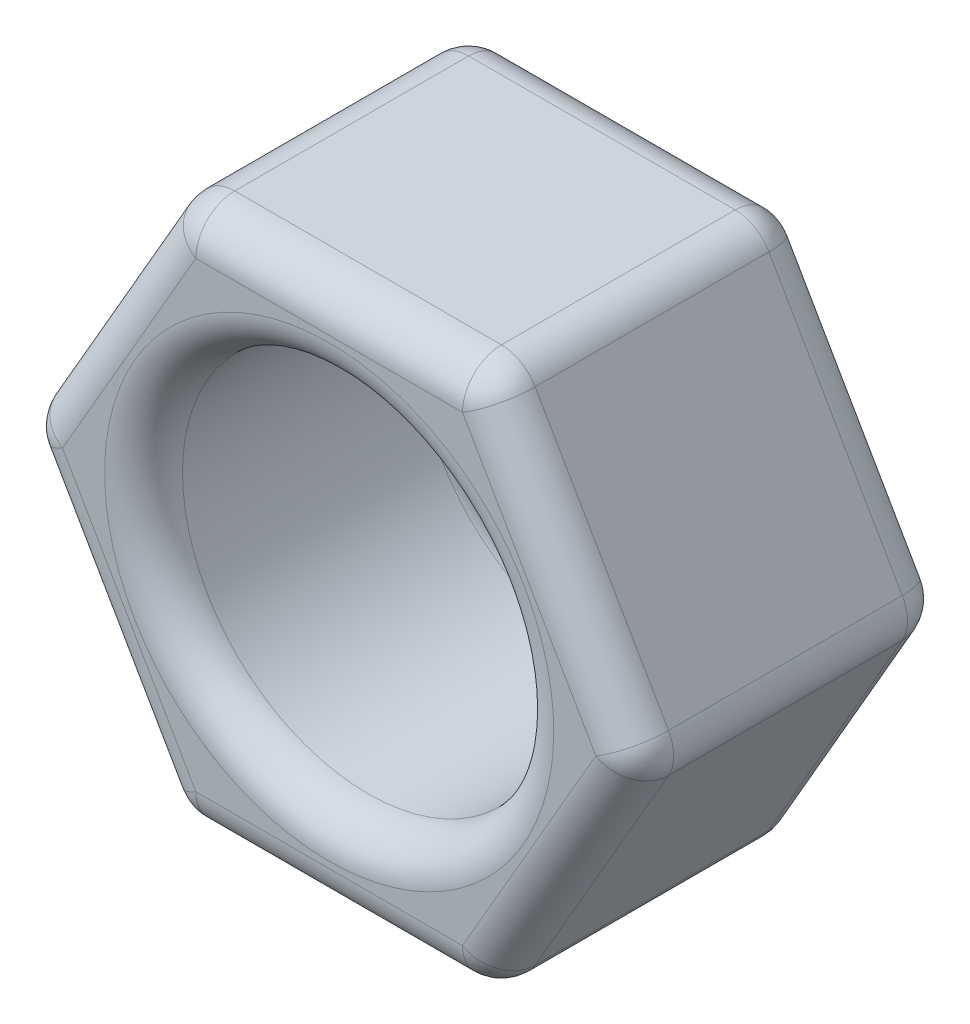
ISO-10303-21;
HEADER;
FILE_DESCRIPTION(('STEP AP214'),'2;1');
FILE_NAME('part.step','',(''),(''),'','','');
FILE_SCHEMA(('AUTOMOTIVE_DESIGN { 1 0 10303 214 1 1 1 1 }'));
ENDSEC;
DATA;
#1=APPLICATION_CONTEXT('core data for automotive mechanical design processes');
#2=APPLICATION_PROTOCOL_DEFINITION('international standard','automotive_design',2000,#1);
#3=PRODUCT_CONTEXT('',#1,'mechanical');
#4=PRODUCT('Part','Part','',(#3));
#5=PRODUCT_RELATED_PRODUCT_CATEGORY('part','',(#4));
#6=PRODUCT_DEFINITION_FORMATION('','',#4);
#7=PRODUCT_DEFINITION_CONTEXT('part definition',#1,'design');
#8=PRODUCT_DEFINITION('design','',#6,#7);
#9=PRODUCT_DEFINITION_SHAPE('','',#8);
#10=(LENGTH_UNIT() NAMED_UNIT(*) SI_UNIT(.MILLI.,.METRE.));
#11=(NAMED_UNIT(*) PLANE_ANGLE_UNIT() SI_UNIT($,.RADIAN.));
#12=(NAMED_UNIT(*) SI_UNIT($,.STERADIAN.) SOLID_ANGLE_UNIT());
#13=UNCERTAINTY_MEASURE_WITH_UNIT(LENGTH_MEASURE(1.E-05),#10,'distance_accuracy_value','');
#14=(GEOMETRIC_REPRESENTATION_CONTEXT(3) GLOBAL_UNCERTAINTY_ASSIGNED_CONTEXT((#13)) GLOBAL_UNIT_ASSIGNED_CONTEXT((#10,
#11,#12)) REPRESENTATION_CONTEXT('',''));
#15=CARTESIAN_POINT('',(0.,0.,0.));
#16=DIRECTION('',(0.,0.,1.));
#17=DIRECTION('',(1.,0.,0.));
#18=AXIS2_PLACEMENT_3D('',#15,#16,#17);
#19=CARTESIAN_POINT('',(7.99999999999999,0.,8.));
#20=DIRECTION('',(0.,0.,1.));
#21=DIRECTION('',(1.,0.,0.));
#22=AXIS2_PLACEMENT_3D('',#19,#20,#21);
#23=PLANE('',#22);
#24=DIRECTION('',(0.5,-0.866025403784439,0.));
#25=VECTOR('',#24,1.);
#26=CARTESIAN_POINT('',(-3.13397459621556,-6.42820323027552,8.));
#27=LINE('',#26,#25);
#28=CARTESIAN_POINT('',(-6.84529946162075,0.,8.));
#29=VERTEX_POINT('',#28);
#30=CARTESIAN_POINT('',(-3.42264973081038,-5.92820323027552,8.));
#31=VERTEX_POINT('',#30);
#32=EDGE_CURVE('E253',#29,#31,#27,.T.);
#33=ORIENTED_EDGE('',*,*,#32,.T.);
#34=DIRECTION('',(1.,0.,0.));
#35=VECTOR('',#34,1.);
#36=CARTESIAN_POINT('',(4.,-5.92820323027552,8.));
#37=LINE('',#36,#35);
#38=CARTESIAN_POINT('',(3.42264973081037,-5.92820323027552,8.));
#39=VERTEX_POINT('',#38);
#40=EDGE_CURVE('E255',#31,#39,#37,.T.);
#41=ORIENTED_EDGE('',*,*,#40,.T.);
#42=DIRECTION('',(0.499999999999999,0.866025403784439,0.));
#43=VECTOR('',#42,1.);
#44=CARTESIAN_POINT('',(7.13397459621555,0.499999999999997,8.));
#45=LINE('',#44,#43);
#46=CARTESIAN_POINT('',(6.84529946162074,0.,8.));
#47=VERTEX_POINT('',#46);
#48=EDGE_CURVE('E245',#39,#47,#45,.T.);
#49=ORIENTED_EDGE('',*,*,#48,.T.);
#50=DIRECTION('',(-0.5,0.866025403784439,0.));
#51=VECTOR('',#50,1.);
#52=CARTESIAN_POINT('',(3.13397459621555,6.42820323027551,8.));
#53=LINE('',#52,#51);
#54=CARTESIAN_POINT('',(3.42264973081037,5.92820323027551,8.));
#55=VERTEX_POINT('',#54);
#56=EDGE_CURVE('E247',#47,#55,#53,.T.);
#57=ORIENTED_EDGE('',*,*,#56,.T.);
#58=DIRECTION('',(-1.,0.,0.));
#59=VECTOR('',#58,1.);
#60=CARTESIAN_POINT('',(-4.,5.92820323027551,8.));
#61=LINE('',#60,#59);
#62=CARTESIAN_POINT('',(-3.42264973081038,5.92820323027551,8.));
#63=VERTEX_POINT('',#62);
#64=EDGE_CURVE('E249',#55,#63,#61,.T.);
#65=ORIENTED_EDGE('',*,*,#64,.T.);
#66=DIRECTION('',(-0.5,-0.866025403784439,0.));
#67=VECTOR('',#66,1.);
#68=CARTESIAN_POINT('',(-7.13397459621556,-0.500000000000003,8.));
#69=LINE('',#68,#67);
#70=EDGE_CURVE('E251',#63,#29,#69,.T.);
#71=ORIENTED_EDGE('',*,*,#70,.T.);
#72=EDGE_LOOP('',(#33,#41,#49,#57,#65,#71));
#73=FACE_BOUND('',#72,.T.);
#74=CARTESIAN_POINT('',(0.,0.,8.));
#75=DIRECTION('',(0.,0.,1.));
#76=DIRECTION('',(1.,0.,0.));
#77=AXIS2_PLACEMENT_3D('',#74,#75,#76);
#78=CIRCLE('',#77,5.765);
#79=CARTESIAN_POINT('',(5.765,0.,8.));
#80=VERTEX_POINT('',#79);
#81=EDGE_CURVE('E242',#80,#80,#78,.F.);
#82=ORIENTED_EDGE('',*,*,#81,.T.);
#83=EDGE_LOOP('',(#82));
#84=FACE_BOUND('',#83,.T.);
#85=ADVANCED_FACE('F31',(#73,#84),#23,.T.);
#86=CARTESIAN_POINT('',(7.99999999999999,0.,0.));
#87=DIRECTION('',(0.,0.,1.));
#88=DIRECTION('',(1.,0.,0.));
#89=AXIS2_PLACEMENT_3D('',#86,#87,#88);
#90=PLANE('',#89);
#91=DIRECTION('',(0.499999999999999,0.866025403784439,0.));
#92=VECTOR('',#91,1.);
#93=CARTESIAN_POINT('',(7.13397459621555,0.499999999999996,0.));
#94=LINE('',#93,#92);
#95=CARTESIAN_POINT('',(6.84529946162074,0.,0.));
#96=VERTEX_POINT('',#95);
#97=CARTESIAN_POINT('',(3.42264973081037,-5.92820323027552,0.));
#98=VERTEX_POINT('',#97);
#99=EDGE_CURVE('E261',#96,#98,#94,.F.);
#100=ORIENTED_EDGE('',*,*,#99,.T.);
#101=DIRECTION('',(1.,0.,0.));
#102=VECTOR('',#101,1.);
#103=CARTESIAN_POINT('',(7.99999999999999,-5.92820323027552,0.));
#104=LINE('',#103,#102);
#105=CARTESIAN_POINT('',(-3.42264973081038,-5.92820323027552,0.));
#106=VERTEX_POINT('',#105);
#107=EDGE_CURVE('E270',#98,#106,#104,.F.);
#108=ORIENTED_EDGE('',*,*,#107,.T.);
#109=DIRECTION('',(0.5,-0.866025403784439,0.));
#110=VECTOR('',#109,1.);
#111=CARTESIAN_POINT('',(-3.13397459621557,-6.42820323027551,0.));
#112=LINE('',#111,#110);
#113=CARTESIAN_POINT('',(-6.84529946162075,0.,0.));
#114=VERTEX_POINT('',#113);
#115=EDGE_CURVE('E56',#106,#114,#112,.F.);
#116=ORIENTED_EDGE('',*,*,#115,.T.);
#117=DIRECTION('',(-0.5,-0.866025403784439,0.));
#118=VECTOR('',#117,1.);
#119=CARTESIAN_POINT('',(-3.13397459621557,6.4282032302755,0.));
#120=LINE('',#119,#118);
#121=CARTESIAN_POINT('',(-3.42264973081038,5.92820323027551,0.));
#122=VERTEX_POINT('',#121);
#123=EDGE_CURVE('E267',#114,#122,#120,.F.);
#124=ORIENTED_EDGE('',*,*,#123,.T.);
#125=DIRECTION('',(-1.,0.,0.));
#126=VECTOR('',#125,1.);
#127=CARTESIAN_POINT('',(7.99999999999999,5.92820323027551,0.));
#128=LINE('',#127,#126);
#129=CARTESIAN_POINT('',(3.42264973081037,5.92820323027551,0.));
#130=VERTEX_POINT('',#129);
#131=EDGE_CURVE('E265',#122,#130,#128,.F.);
#132=ORIENTED_EDGE('',*,*,#131,.T.);
#133=DIRECTION('',(-0.5,0.866025403784439,0.));
#134=VECTOR('',#133,1.);
#135=CARTESIAN_POINT('',(7.13397459621556,-0.500000000000003,0.));
#136=LINE('',#135,#134);
#137=EDGE_CURVE('E263',#130,#96,#136,.F.);
#138=ORIENTED_EDGE('',*,*,#137,.T.);
#139=EDGE_LOOP('',(#100,#108,#116,#124,#132,#138));
#140=FACE_BOUND('',#139,.T.);
#141=CARTESIAN_POINT('',(0.,0.,0.));
#142=DIRECTION('',(0.,0.,1.));
#143=DIRECTION('',(1.,0.,0.));
#144=AXIS2_PLACEMENT_3D('',#141,#142,#143);
#145=CIRCLE('',#144,5.765);
#146=CARTESIAN_POINT('',(5.765,0.,0.));
#147=VERTEX_POINT('',#146);
#148=EDGE_CURVE('E258',#147,#147,#145,.T.);
#149=ORIENTED_EDGE('',*,*,#148,.T.);
#150=EDGE_LOOP('',(#149));
#151=FACE_BOUND('',#150,.T.);
#152=ADVANCED_FACE('F430',(#140,#151),#90,.F.);
#153=CARTESIAN_POINT('',(4.,-6.92820323027552,8.));
#154=DIRECTION('',(-0.866025403784439,0.499999999999999,0.));
#155=DIRECTION('',(-0.499999999999999,-0.866025403784439,0.));
#156=AXIS2_PLACEMENT_3D('',#153,#154,#155);
#157=PLANE('',#156);
#158=DIRECTION('',(0.,0.,-1.));
#159=VECTOR('',#158,1.);
#160=CARTESIAN_POINT('',(7.71132486540518,-0.500000000000002,8.));
#161=LINE('',#160,#159);
#162=CARTESIAN_POINT('',(7.71132486540518,-0.500000000000002,1.));
#163=VERTEX_POINT('',#162);
#164=CARTESIAN_POINT('',(7.71132486540518,-0.500000000000002,7.));
#165=VERTEX_POINT('',#164);
#166=EDGE_CURVE('E167',#163,#165,#161,.F.);
#167=ORIENTED_EDGE('',*,*,#166,.T.);
#168=DIRECTION('',(0.499999999999999,0.866025403784439,0.));
#169=VECTOR('',#168,1.);
#170=CARTESIAN_POINT('',(4.,-6.92820323027552,7.));
#171=LINE('',#170,#169);
#172=CARTESIAN_POINT('',(4.28867513459481,-6.42820323027552,7.));
#173=VERTEX_POINT('',#172);
#174=EDGE_CURVE('E204',#165,#173,#171,.F.);
#175=ORIENTED_EDGE('',*,*,#174,.T.);
#176=DIRECTION('',(0.,0.,-1.));
#177=VECTOR('',#176,1.);
#178=CARTESIAN_POINT('',(4.28867513459481,-6.42820323027552,8.));
#179=LINE('',#178,#177);
#180=CARTESIAN_POINT('',(4.28867513459481,-6.42820323027552,1.));
#181=VERTEX_POINT('',#180);
#182=EDGE_CURVE('E201',#173,#181,#179,.T.);
#183=ORIENTED_EDGE('',*,*,#182,.T.);
#184=DIRECTION('',(0.499999999999999,0.866025403784439,0.));
#185=VECTOR('',#184,1.);
#186=CARTESIAN_POINT('',(4.,-6.92820323027552,1.));
#187=LINE('',#186,#185);
#188=EDGE_CURVE('E196',#181,#163,#187,.T.);
#189=ORIENTED_EDGE('',*,*,#188,.T.);
#190=EDGE_LOOP('',(#167,#175,#183,#189));
#191=FACE_BOUND('',#190,.T.);
#192=ADVANCED_FACE('F435',(#191),#157,.F.);
#193=CARTESIAN_POINT('',(7.99999999999999,0.,8.));
#194=DIRECTION('',(-0.866025403784439,-0.5,0.));
#195=DIRECTION('',(0.5,-0.866025403784439,0.));
#196=AXIS2_PLACEMENT_3D('',#193,#194,#195);
#197=PLANE('',#196);
#198=DIRECTION('',(0.,0.,-1.));
#199=VECTOR('',#198,1.);
#200=CARTESIAN_POINT('',(4.28867513459481,6.42820323027551,8.));
#201=LINE('',#200,#199);
#202=CARTESIAN_POINT('',(4.28867513459481,6.42820323027551,1.));
#203=VERTEX_POINT('',#202);
#204=CARTESIAN_POINT('',(4.28867513459481,6.42820323027551,7.));
#205=VERTEX_POINT('',#204);
#206=EDGE_CURVE('E189',#203,#205,#201,.F.);
#207=ORIENTED_EDGE('',*,*,#206,.T.);
#208=DIRECTION('',(-0.5,0.866025403784439,0.));
#209=VECTOR('',#208,1.);
#210=CARTESIAN_POINT('',(7.99999999999999,0.,7.));
#211=LINE('',#210,#209);
#212=CARTESIAN_POINT('',(7.71132486540518,0.499999999999997,7.));
#213=VERTEX_POINT('',#212);
#214=EDGE_CURVE('E193',#205,#213,#211,.F.);
#215=ORIENTED_EDGE('',*,*,#214,.T.);
#216=DIRECTION('',(0.,0.,-1.));
#217=VECTOR('',#216,1.);
#218=CARTESIAN_POINT('',(7.71132486540518,0.499999999999997,8.));
#219=LINE('',#218,#217);
#220=CARTESIAN_POINT('',(7.71132486540518,0.499999999999997,1.));
#221=VERTEX_POINT('',#220);
#222=EDGE_CURVE('E165',#213,#221,#219,.T.);
#223=ORIENTED_EDGE('',*,*,#222,.T.);
#224=DIRECTION('',(-0.5,0.866025403784439,0.));
#225=VECTOR('',#224,1.);
#226=CARTESIAN_POINT('',(7.99999999999999,0.,1.));
#227=LINE('',#226,#225);
#228=EDGE_CURVE('E183',#221,#203,#227,.T.);
#229=ORIENTED_EDGE('',*,*,#228,.T.);
#230=EDGE_LOOP('',(#207,#215,#223,#229));
#231=FACE_BOUND('',#230,.T.);
#232=ADVANCED_FACE('F191',(#231),#197,.F.);
#233=CARTESIAN_POINT('',(3.99999999999999,6.92820323027551,8.));
#234=DIRECTION('',(0.,-1.,0.));
#235=DIRECTION('',(0.,0.,-1.));
#236=AXIS2_PLACEMENT_3D('',#233,#234,#235);
#237=PLANE('',#236);
#238=DIRECTION('',(0.,0.,-1.));
#239=VECTOR('',#238,1.);
#240=CARTESIAN_POINT('',(-3.42264973081038,6.92820323027551,8.));
#241=LINE('',#240,#239);
#242=CARTESIAN_POINT('',(-3.42264973081038,6.92820323027551,1.));
#243=VERTEX_POINT('',#242);
#244=CARTESIAN_POINT('',(-3.42264973081038,6.92820323027551,7.));
#245=VERTEX_POINT('',#244);
#246=EDGE_CURVE('E208',#243,#245,#241,.F.);
#247=ORIENTED_EDGE('',*,*,#246,.T.);
#248=DIRECTION('',(-1.,0.,0.));
#249=VECTOR('',#248,1.);
#250=CARTESIAN_POINT('',(3.99999999999999,6.92820323027551,7.));
#251=LINE('',#250,#249);
#252=CARTESIAN_POINT('',(3.42264973081037,6.92820323027551,7.));
#253=VERTEX_POINT('',#252);
#254=EDGE_CURVE('E213',#245,#253,#251,.F.);
#255=ORIENTED_EDGE('',*,*,#254,.T.);
#256=DIRECTION('',(0.,0.,-1.));
#257=VECTOR('',#256,1.);
#258=CARTESIAN_POINT('',(3.42264973081037,6.92820323027551,8.));
#259=LINE('',#258,#257);
#260=CARTESIAN_POINT('',(3.42264973081037,6.92820323027551,1.));
#261=VERTEX_POINT('',#260);
#262=EDGE_CURVE('E210',#253,#261,#259,.T.);
#263=ORIENTED_EDGE('',*,*,#262,.T.);
#264=DIRECTION('',(-1.,0.,0.));
#265=VECTOR('',#264,1.);
#266=CARTESIAN_POINT('',(3.99999999999999,6.92820323027551,1.));
#267=LINE('',#266,#265);
#268=EDGE_CURVE('E206',#261,#243,#267,.T.);
#269=ORIENTED_EDGE('',*,*,#268,.T.);
#270=EDGE_LOOP('',(#247,#255,#263,#269));
#271=FACE_BOUND('',#270,.T.);
#272=ADVANCED_FACE('F448',(#271),#237,.F.);
#273=CARTESIAN_POINT('',(-4.,6.92820323027551,8.));
#274=DIRECTION('',(0.866025403784439,-0.5,0.));
#275=DIRECTION('',(0.5,0.866025403784439,0.));
#276=AXIS2_PLACEMENT_3D('',#273,#274,#275);
#277=PLANE('',#276);
#278=DIRECTION('',(0.,0.,-1.));
#279=VECTOR('',#278,1.);
#280=CARTESIAN_POINT('',(-7.71132486540519,0.499999999999996,8.));
#281=LINE('',#280,#279);
#282=CARTESIAN_POINT('',(-7.71132486540519,0.499999999999996,1.));
#283=VERTEX_POINT('',#282);
#284=CARTESIAN_POINT('',(-7.71132486540519,0.499999999999996,7.));
#285=VERTEX_POINT('',#284);
#286=EDGE_CURVE('E217',#283,#285,#281,.F.);
#287=ORIENTED_EDGE('',*,*,#286,.T.);
#288=DIRECTION('',(-0.5,-0.866025403784439,0.));
#289=VECTOR('',#288,1.);
#290=CARTESIAN_POINT('',(-4.,6.92820323027551,7.));
#291=LINE('',#290,#289);
#292=CARTESIAN_POINT('',(-4.28867513459482,6.42820323027551,7.));
#293=VERTEX_POINT('',#292);
#294=EDGE_CURVE('E222',#285,#293,#291,.F.);
#295=ORIENTED_EDGE('',*,*,#294,.T.);
#296=DIRECTION('',(0.,0.,-1.));
#297=VECTOR('',#296,1.);
#298=CARTESIAN_POINT('',(-4.28867513459482,6.42820323027551,8.));
#299=LINE('',#298,#297);
#300=CARTESIAN_POINT('',(-4.28867513459482,6.42820323027551,1.));
#301=VERTEX_POINT('',#300);
#302=EDGE_CURVE('E219',#293,#301,#299,.T.);
#303=ORIENTED_EDGE('',*,*,#302,.T.);
#304=DIRECTION('',(-0.5,-0.866025403784439,0.));
#305=VECTOR('',#304,1.);
#306=CARTESIAN_POINT('',(-4.,6.92820323027551,1.));
#307=LINE('',#306,#305);
#308=EDGE_CURVE('E215',#301,#283,#307,.T.);
#309=ORIENTED_EDGE('',*,*,#308,.T.);
#310=EDGE_LOOP('',(#287,#295,#303,#309));
#311=FACE_BOUND('',#310,.T.);
#312=ADVANCED_FACE('F389',(#311),#277,.F.);
#313=CARTESIAN_POINT('',(-8.,0.,8.));
#314=DIRECTION('',(0.866025403784439,0.5,0.));
#315=DIRECTION('',(-0.5,0.866025403784439,0.));
#316=AXIS2_PLACEMENT_3D('',#313,#314,#315);
#317=PLANE('',#316);
#318=DIRECTION('',(0.,0.,-1.));
#319=VECTOR('',#318,1.);
#320=CARTESIAN_POINT('',(-4.28867513459482,-6.42820323027552,8.));
#321=LINE('',#320,#319);
#322=CARTESIAN_POINT('',(-4.28867513459482,-6.42820323027552,1.));
#323=VERTEX_POINT('',#322);
#324=CARTESIAN_POINT('',(-4.28867513459482,-6.42820323027552,7.));
#325=VERTEX_POINT('',#324);
#326=EDGE_CURVE('E226',#323,#325,#321,.F.);
#327=ORIENTED_EDGE('',*,*,#326,.T.);
#328=DIRECTION('',(0.5,-0.866025403784439,0.));
#329=VECTOR('',#328,1.);
#330=CARTESIAN_POINT('',(-8.,0.,7.));
#331=LINE('',#330,#329);
#332=CARTESIAN_POINT('',(-7.71132486540519,-0.500000000000004,7.));
#333=VERTEX_POINT('',#332);
#334=EDGE_CURVE('E231',#325,#333,#331,.F.);
#335=ORIENTED_EDGE('',*,*,#334,.T.);
#336=DIRECTION('',(0.,0.,-1.));
#337=VECTOR('',#336,1.);
#338=CARTESIAN_POINT('',(-7.71132486540519,-0.500000000000004,8.));
#339=LINE('',#338,#337);
#340=CARTESIAN_POINT('',(-7.71132486540519,-0.500000000000004,1.));
#341=VERTEX_POINT('',#340);
#342=EDGE_CURVE('E228',#333,#341,#339,.T.);
#343=ORIENTED_EDGE('',*,*,#342,.T.);
#344=DIRECTION('',(0.5,-0.866025403784439,0.));
#345=VECTOR('',#344,1.);
#346=CARTESIAN_POINT('',(-8.,0.,1.));
#347=LINE('',#346,#345);
#348=EDGE_CURVE('E224',#341,#323,#347,.T.);
#349=ORIENTED_EDGE('',*,*,#348,.T.);
#350=EDGE_LOOP('',(#327,#335,#343,#349));
#351=FACE_BOUND('',#350,.T.);
#352=ADVANCED_FACE('F405',(#351),#317,.F.);
#353=CARTESIAN_POINT('',(-4.,-6.92820323027552,8.));
#354=DIRECTION('',(0.,1.,0.));
#355=DIRECTION('',(0.,0.,1.));
#356=AXIS2_PLACEMENT_3D('',#353,#354,#355);
#357=PLANE('',#356);
#358=DIRECTION('',(0.,0.,-1.));
#359=VECTOR('',#358,1.);
#360=CARTESIAN_POINT('',(3.42264973081037,-6.92820323027552,8.));
#361=LINE('',#360,#359);
#362=CARTESIAN_POINT('',(3.42264973081037,-6.92820323027552,1.));
#363=VERTEX_POINT('',#362);
#364=CARTESIAN_POINT('',(3.42264973081037,-6.92820323027552,7.));
#365=VERTEX_POINT('',#364);
#366=EDGE_CURVE('E235',#363,#365,#361,.F.);
#367=ORIENTED_EDGE('',*,*,#366,.T.);
#368=DIRECTION('',(1.,0.,0.));
#369=VECTOR('',#368,1.);
#370=CARTESIAN_POINT('',(-4.,-6.92820323027552,7.));
#371=LINE('',#370,#369);
#372=CARTESIAN_POINT('',(-3.42264973081038,-6.92820323027552,7.));
#373=VERTEX_POINT('',#372);
#374=EDGE_CURVE('E240',#365,#373,#371,.F.);
#375=ORIENTED_EDGE('',*,*,#374,.T.);
#376=DIRECTION('',(0.,0.,-1.));
#377=VECTOR('',#376,1.);
#378=CARTESIAN_POINT('',(-3.42264973081038,-6.92820323027552,8.));
#379=LINE('',#378,#377);
#380=CARTESIAN_POINT('',(-3.42264973081038,-6.92820323027552,1.));
#381=VERTEX_POINT('',#380);
#382=EDGE_CURVE('E237',#373,#381,#379,.T.);
#383=ORIENTED_EDGE('',*,*,#382,.T.);
#384=DIRECTION('',(1.,0.,0.));
#385=VECTOR('',#384,1.);
#386=CARTESIAN_POINT('',(-4.,-6.92820323027552,1.));
#387=LINE('',#386,#385);
#388=EDGE_CURVE('E233',#381,#363,#387,.T.);
#389=ORIENTED_EDGE('',*,*,#388,.T.);
#390=EDGE_LOOP('',(#367,#375,#383,#389));
#391=FACE_BOUND('',#390,.T.);
#392=ADVANCED_FACE('F440',(#391),#357,.F.);
#393=CARTESIAN_POINT('',(0.,0.,8.));
#394=DIRECTION('',(0.,0.,-1.));
#395=DIRECTION('',(-1.,0.,0.));
#396=AXIS2_PLACEMENT_3D('',#393,#394,#395);
#397=CYLINDRICAL_SURFACE('',#396,4.765);
#398=CARTESIAN_POINT('',(0.,0.,7.));
#399=DIRECTION('',(0.,0.,1.));
#400=DIRECTION('',(1.,0.,0.));
#401=AXIS2_PLACEMENT_3D('',#398,#399,#400);
#402=CIRCLE('',#401,4.765);
#403=CARTESIAN_POINT('',(4.765,0.,7.));
#404=VERTEX_POINT('',#403);
#405=EDGE_CURVE('E11',#404,#404,#402,.T.);
#406=ORIENTED_EDGE('',*,*,#405,.T.);
#407=EDGE_LOOP('',(#406));
#408=FACE_BOUND('',#407,.T.);
#409=CARTESIAN_POINT('',(0.,0.,1.));
#410=DIRECTION('',(0.,0.,1.));
#411=DIRECTION('',(1.,0.,0.));
#412=AXIS2_PLACEMENT_3D('',#409,#410,#411);
#413=CIRCLE('',#412,4.765);
#414=CARTESIAN_POINT('',(4.765,0.,1.));
#415=VERTEX_POINT('',#414);
#416=EDGE_CURVE('E40',#415,#415,#413,.F.);
#417=ORIENTED_EDGE('',*,*,#416,.T.);
#418=EDGE_LOOP('',(#417));
#419=FACE_BOUND('',#418,.T.);
#420=ADVANCED_FACE('F438',(#408,#419),#397,.F.);
#421=CARTESIAN_POINT('',(-6.84529946162075,0.,8.));
#422=DIRECTION('',(0.,0.,-1.));
#423=DIRECTION('',(-1.,0.,0.));
#424=AXIS2_PLACEMENT_3D('',#421,#422,#423);
#425=CYLINDRICAL_SURFACE('',#424,1.);
#426=CARTESIAN_POINT('',(-6.84529946162075,0.,7.));
#427=DIRECTION('',(0.,0.,1.));
#428=DIRECTION('',(1.,0.,0.));
#429=AXIS2_PLACEMENT_3D('',#426,#427,#428);
#430=CIRCLE('',#429,1.);
#431=EDGE_CURVE('E35',#285,#333,#430,.T.);
#432=ORIENTED_EDGE('',*,*,#431,.F.);
#433=ORIENTED_EDGE('',*,*,#286,.F.);
#434=CARTESIAN_POINT('',(-6.84529946162075,0.,1.));
#435=DIRECTION('',(0.,0.,-1.));
#436=DIRECTION('',(-1.,0.,0.));
#437=AXIS2_PLACEMENT_3D('',#434,#435,#436);
#438=CIRCLE('',#437,1.);
#439=EDGE_CURVE('E356',#341,#283,#438,.T.);
#440=ORIENTED_EDGE('',*,*,#439,.F.);
#441=ORIENTED_EDGE('',*,*,#342,.F.);
#442=EDGE_LOOP('',(#432,#433,#440,#441));
#443=FACE_BOUND('',#442,.T.);
#444=ADVANCED_FACE('F403',(#443),#425,.T.);
#445=CARTESIAN_POINT('',(-6.84529946162075,0.,7.));
#446=DIRECTION('',(0.,0.,1.));
#447=DIRECTION('',(1.,0.,0.));
#448=AXIS2_PLACEMENT_3D('',#445,#446,#447);
#449=SPHERICAL_SURFACE('',#448,1.);
#450=CARTESIAN_POINT('',(-6.84529946162075,0.,7.));
#451=DIRECTION('',(-0.5,-0.866025403784438,0.));
#452=DIRECTION('',(0.866025403784438,-0.5,0.));
#453=AXIS2_PLACEMENT_3D('',#450,#451,#452);
#454=CIRCLE('',#453,1.);
#455=EDGE_CURVE('E351',#285,#29,#454,.F.);
#456=ORIENTED_EDGE('',*,*,#455,.F.);
#457=ORIENTED_EDGE('',*,*,#431,.T.);
#458=CARTESIAN_POINT('',(-6.84529946162075,0.,7.));
#459=DIRECTION('',(-0.5,0.866025403784439,0.));
#460=DIRECTION('',(-0.866025403784439,-0.5,0.));
#461=AXIS2_PLACEMENT_3D('',#458,#459,#460);
#462=CIRCLE('',#461,1.);
#463=EDGE_CURVE('E354',#29,#333,#462,.F.);
#464=ORIENTED_EDGE('',*,*,#463,.F.);
#465=EDGE_LOOP('',(#456,#457,#464));
#466=FACE_BOUND('',#465,.T.);
#467=ADVANCED_FACE('F367',(#466),#449,.T.);
#468=CARTESIAN_POINT('',(-6.84529946162075,0.,1.));
#469=DIRECTION('',(0.,0.,1.));
#470=DIRECTION('',(1.,0.,0.));
#471=AXIS2_PLACEMENT_3D('',#468,#469,#470);
#472=SPHERICAL_SURFACE('',#471,1.);
#473=CARTESIAN_POINT('',(-6.84529946162075,0.,1.));
#474=DIRECTION('',(-0.5,0.866025403784439,0.));
#475=DIRECTION('',(-0.866025403784439,-0.5,0.));
#476=AXIS2_PLACEMENT_3D('',#473,#474,#475);
#477=CIRCLE('',#476,1.);
#478=EDGE_CURVE('E346',#341,#114,#477,.F.);
#479=ORIENTED_EDGE('',*,*,#478,.F.);
#480=ORIENTED_EDGE('',*,*,#439,.T.);
#481=CARTESIAN_POINT('',(-6.84529946162075,0.,1.));
#482=DIRECTION('',(-0.5,-0.866025403784439,0.));
#483=DIRECTION('',(0.866025403784439,-0.5,0.));
#484=AXIS2_PLACEMENT_3D('',#481,#482,#483);
#485=CIRCLE('',#484,1.);
#486=EDGE_CURVE('E348',#114,#283,#485,.F.);
#487=ORIENTED_EDGE('',*,*,#486,.F.);
#488=EDGE_LOOP('',(#479,#480,#487));
#489=FACE_BOUND('',#488,.T.);
#490=ADVANCED_FACE('F539',(#489),#472,.T.);
#491=CARTESIAN_POINT('',(-3.13397459621557,-6.42820323027551,7.));
#492=DIRECTION('',(-0.5,0.866025403784439,0.));
#493=DIRECTION('',(-0.866025403784439,-0.5,0.));
#494=AXIS2_PLACEMENT_3D('',#491,#492,#493);
#495=CYLINDRICAL_SURFACE('',#494,1.);
#496=ORIENTED_EDGE('',*,*,#463,.T.);
#497=ORIENTED_EDGE('',*,*,#334,.F.);
#498=CARTESIAN_POINT('',(-3.42264973081038,-5.92820323027552,7.));
#499=DIRECTION('',(0.5,-0.866025403784439,0.));
#500=DIRECTION('',(0.866025403784439,0.5,0.));
#501=AXIS2_PLACEMENT_3D('',#498,#499,#500);
#502=CIRCLE('',#501,1.);
#503=EDGE_CURVE('E340',#31,#325,#502,.T.);
#504=ORIENTED_EDGE('',*,*,#503,.F.);
#505=ORIENTED_EDGE('',*,*,#32,.F.);
#506=EDGE_LOOP('',(#496,#497,#504,#505));
#507=FACE_BOUND('',#506,.T.);
#508=ADVANCED_FACE('F375',(#507),#495,.T.);
#509=CARTESIAN_POINT('',(-3.13397459621557,6.4282032302755,7.));
#510=DIRECTION('',(0.5,0.866025403784439,0.));
#511=DIRECTION('',(-0.866025403784439,0.5,0.));
#512=AXIS2_PLACEMENT_3D('',#509,#510,#511);
#513=CYLINDRICAL_SURFACE('',#512,1.);
#514=ORIENTED_EDGE('',*,*,#455,.T.);
#515=ORIENTED_EDGE('',*,*,#70,.F.);
#516=CARTESIAN_POINT('',(-3.42264973081038,5.92820323027551,7.));
#517=DIRECTION('',(0.5,0.866025403784439,0.));
#518=DIRECTION('',(-0.866025403784439,0.5,0.));
#519=AXIS2_PLACEMENT_3D('',#516,#517,#518);
#520=CIRCLE('',#519,1.);
#521=EDGE_CURVE('E337',#293,#63,#520,.T.);
#522=ORIENTED_EDGE('',*,*,#521,.F.);
#523=ORIENTED_EDGE('',*,*,#294,.F.);
#524=EDGE_LOOP('',(#514,#515,#522,#523));
#525=FACE_BOUND('',#524,.T.);
#526=ADVANCED_FACE('F386',(#525),#513,.T.);
#527=CARTESIAN_POINT('',(-3.42264973081038,5.92820323027551,8.));
#528=DIRECTION('',(0.,0.,-1.));
#529=DIRECTION('',(-1.,0.,0.));
#530=AXIS2_PLACEMENT_3D('',#527,#528,#529);
#531=CYLINDRICAL_SURFACE('',#530,1.);
#532=CARTESIAN_POINT('',(-3.42264973081038,5.92820323027551,1.));
#533=DIRECTION('',(0.,0.,-1.));
#534=DIRECTION('',(-1.,0.,0.));
#535=AXIS2_PLACEMENT_3D('',#532,#533,#534);
#536=CIRCLE('',#535,1.);
#537=EDGE_CURVE('E331',#301,#243,#536,.T.);
#538=ORIENTED_EDGE('',*,*,#537,.F.);
#539=ORIENTED_EDGE('',*,*,#302,.F.);
#540=CARTESIAN_POINT('',(-3.42264973081038,5.92820323027551,7.));
#541=DIRECTION('',(0.,0.,1.));
#542=DIRECTION('',(1.,0.,0.));
#543=AXIS2_PLACEMENT_3D('',#540,#541,#542);
#544=CIRCLE('',#543,1.);
#545=EDGE_CURVE('E334',#245,#293,#544,.T.);
#546=ORIENTED_EDGE('',*,*,#545,.F.);
#547=ORIENTED_EDGE('',*,*,#246,.F.);
#548=EDGE_LOOP('',(#538,#539,#546,#547));
#549=FACE_BOUND('',#548,.T.);
#550=ADVANCED_FACE('F393',(#549),#531,.T.);
#551=CARTESIAN_POINT('',(-3.13397459621556,6.42820323027551,1.));
#552=DIRECTION('',(-0.5,-0.866025403784439,0.));
#553=DIRECTION('',(0.866025403784439,-0.5,0.));
#554=AXIS2_PLACEMENT_3D('',#551,#552,#553);
#555=CYLINDRICAL_SURFACE('',#554,1.);
#556=ORIENTED_EDGE('',*,*,#486,.T.);
#557=ORIENTED_EDGE('',*,*,#308,.F.);
#558=CARTESIAN_POINT('',(-3.42264973081038,5.92820323027551,1.));
#559=DIRECTION('',(0.499999999999999,0.866025403784439,0.));
#560=DIRECTION('',(-0.866025403784439,0.499999999999999,0.));
#561=AXIS2_PLACEMENT_3D('',#558,#559,#560);
#562=CIRCLE('',#561,1.);
#563=EDGE_CURVE('E329',#122,#301,#562,.T.);
#564=ORIENTED_EDGE('',*,*,#563,.F.);
#565=ORIENTED_EDGE('',*,*,#123,.F.);
#566=EDGE_LOOP('',(#556,#557,#564,#565));
#567=FACE_BOUND('',#566,.T.);
#568=ADVANCED_FACE('F401',(#567),#555,.T.);
#569=CARTESIAN_POINT('',(-7.13397459621557,0.499999999999995,1.));
#570=DIRECTION('',(0.5,-0.866025403784439,0.));
#571=DIRECTION('',(0.866025403784439,0.5,0.));
#572=AXIS2_PLACEMENT_3D('',#569,#570,#571);
#573=CYLINDRICAL_SURFACE('',#572,1.);
#574=ORIENTED_EDGE('',*,*,#478,.T.);
#575=ORIENTED_EDGE('',*,*,#115,.F.);
#576=CARTESIAN_POINT('',(-3.42264973081038,-5.92820323027552,1.));
#577=DIRECTION('',(0.5,-0.866025403784439,0.));
#578=DIRECTION('',(0.866025403784439,0.5,0.));
#579=AXIS2_PLACEMENT_3D('',#576,#577,#578);
#580=CIRCLE('',#579,1.);
#581=EDGE_CURVE('E327',#323,#106,#580,.T.);
#582=ORIENTED_EDGE('',*,*,#581,.F.);
#583=ORIENTED_EDGE('',*,*,#348,.F.);
#584=EDGE_LOOP('',(#574,#575,#582,#583));
#585=FACE_BOUND('',#584,.T.);
#586=ADVANCED_FACE('F413',(#585),#573,.T.);
#587=CARTESIAN_POINT('',(-3.42264973081038,-5.92820323027552,8.));
#588=DIRECTION('',(0.,0.,-1.));
#589=DIRECTION('',(-1.,0.,0.));
#590=AXIS2_PLACEMENT_3D('',#587,#588,#589);
#591=CYLINDRICAL_SURFACE('',#590,1.);
#592=CARTESIAN_POINT('',(-3.42264973081038,-5.92820323027552,7.));
#593=DIRECTION('',(0.,0.,1.));
#594=DIRECTION('',(1.,0.,0.));
#595=AXIS2_PLACEMENT_3D('',#592,#593,#594);
#596=CIRCLE('',#595,1.);
#597=EDGE_CURVE('E343',#325,#373,#596,.T.);
#598=ORIENTED_EDGE('',*,*,#597,.F.);
#599=ORIENTED_EDGE('',*,*,#326,.F.);
#600=CARTESIAN_POINT('',(-3.42264973081038,-5.92820323027552,1.));
#601=DIRECTION('',(0.,0.,-1.));
#602=DIRECTION('',(-1.,0.,0.));
#603=AXIS2_PLACEMENT_3D('',#600,#601,#602);
#604=CIRCLE('',#603,1.);
#605=EDGE_CURVE('E324',#381,#323,#604,.T.);
#606=ORIENTED_EDGE('',*,*,#605,.F.);
#607=ORIENTED_EDGE('',*,*,#382,.F.);
#608=EDGE_LOOP('',(#598,#599,#606,#607));
#609=FACE_BOUND('',#608,.T.);
#610=ADVANCED_FACE('F410',(#609),#591,.T.);
#611=CARTESIAN_POINT('',(-3.42264973081038,-5.92820323027552,7.));
#612=DIRECTION('',(0.,0.,1.));
#613=DIRECTION('',(1.,0.,0.));
#614=AXIS2_PLACEMENT_3D('',#611,#612,#613);
#615=SPHERICAL_SURFACE('',#614,1.);
#616=ORIENTED_EDGE('',*,*,#503,.T.);
#617=ORIENTED_EDGE('',*,*,#597,.T.);
#618=CARTESIAN_POINT('',(-3.42264973081038,-5.92820323027552,7.));
#619=DIRECTION('',(-1.,0.,0.));
#620=DIRECTION('',(0.,0.,1.));
#621=AXIS2_PLACEMENT_3D('',#618,#619,#620);
#622=CIRCLE('',#621,1.);
#623=EDGE_CURVE('E321',#31,#373,#622,.F.);
#624=ORIENTED_EDGE('',*,*,#623,.F.);
#625=EDGE_LOOP('',(#616,#617,#624));
#626=FACE_BOUND('',#625,.T.);
#627=ADVANCED_FACE('F519',(#626),#615,.T.);
#628=CARTESIAN_POINT('',(-3.42264973081038,5.92820323027551,7.));
#629=DIRECTION('',(0.,0.,1.));
#630=DIRECTION('',(1.,0.,0.));
#631=AXIS2_PLACEMENT_3D('',#628,#629,#630);
#632=SPHERICAL_SURFACE('',#631,1.);
#633=ORIENTED_EDGE('',*,*,#545,.T.);
#634=ORIENTED_EDGE('',*,*,#521,.T.);
#635=CARTESIAN_POINT('',(-3.42264973081038,5.92820323027551,7.));
#636=DIRECTION('',(-1.,0.,0.));
#637=DIRECTION('',(0.,0.,1.));
#638=AXIS2_PLACEMENT_3D('',#635,#636,#637);
#639=CIRCLE('',#638,1.);
#640=EDGE_CURVE('E318',#245,#63,#639,.F.);
#641=ORIENTED_EDGE('',*,*,#640,.F.);
#642=EDGE_LOOP('',(#633,#634,#641));
#643=FACE_BOUND('',#642,.T.);
#644=ADVANCED_FACE('F427',(#643),#632,.T.);
#645=CARTESIAN_POINT('',(-3.42264973081038,5.92820323027551,1.));
#646=DIRECTION('',(0.,0.,1.));
#647=DIRECTION('',(1.,0.,0.));
#648=AXIS2_PLACEMENT_3D('',#645,#646,#647);
#649=SPHERICAL_SURFACE('',#648,1.);
#650=ORIENTED_EDGE('',*,*,#563,.T.);
#651=ORIENTED_EDGE('',*,*,#537,.T.);
#652=CARTESIAN_POINT('',(-3.42264973081038,5.92820323027551,1.));
#653=DIRECTION('',(-1.,0.,0.));
#654=DIRECTION('',(0.,0.,1.));
#655=AXIS2_PLACEMENT_3D('',#652,#653,#654);
#656=CIRCLE('',#655,1.);
#657=EDGE_CURVE('E315',#122,#243,#656,.F.);
#658=ORIENTED_EDGE('',*,*,#657,.F.);
#659=EDGE_LOOP('',(#650,#651,#658));
#660=FACE_BOUND('',#659,.T.);
#661=ADVANCED_FACE('F418',(#660),#649,.T.);
#662=CARTESIAN_POINT('',(-3.42264973081038,-5.92820323027552,1.));
#663=DIRECTION('',(0.,0.,1.));
#664=DIRECTION('',(1.,0.,0.));
#665=AXIS2_PLACEMENT_3D('',#662,#663,#664);
#666=SPHERICAL_SURFACE('',#665,1.);
#667=ORIENTED_EDGE('',*,*,#605,.T.);
#668=ORIENTED_EDGE('',*,*,#581,.T.);
#669=CARTESIAN_POINT('',(-3.42264973081038,-5.92820323027552,1.));
#670=DIRECTION('',(-1.,0.,0.));
#671=DIRECTION('',(0.,0.,1.));
#672=AXIS2_PLACEMENT_3D('',#669,#670,#671);
#673=CIRCLE('',#672,1.);
#674=EDGE_CURVE('E48',#381,#106,#673,.F.);
#675=ORIENTED_EDGE('',*,*,#674,.F.);
#676=EDGE_LOOP('',(#667,#668,#675));
#677=FACE_BOUND('',#676,.T.);
#678=ADVANCED_FACE('F415',(#677),#666,.T.);
#679=CARTESIAN_POINT('',(7.99999999999999,-5.92820323027552,7.));
#680=DIRECTION('',(-1.,0.,0.));
#681=DIRECTION('',(0.,0.,1.));
#682=AXIS2_PLACEMENT_3D('',#679,#680,#681);
#683=CYLINDRICAL_SURFACE('',#682,1.);
#684=ORIENTED_EDGE('',*,*,#623,.T.);
#685=ORIENTED_EDGE('',*,*,#374,.F.);
#686=CARTESIAN_POINT('',(3.42264973081037,-5.92820323027552,7.));
#687=DIRECTION('',(1.,0.,0.));
#688=DIRECTION('',(0.,1.,0.));
#689=AXIS2_PLACEMENT_3D('',#686,#687,#688);
#690=CIRCLE('',#689,1.);
#691=EDGE_CURVE('E308',#39,#365,#690,.T.);
#692=ORIENTED_EDGE('',*,*,#691,.F.);
#693=ORIENTED_EDGE('',*,*,#40,.F.);
#694=EDGE_LOOP('',(#684,#685,#692,#693));
#695=FACE_BOUND('',#694,.T.);
#696=ADVANCED_FACE('F417',(#695),#683,.T.);
#697=CARTESIAN_POINT('',(7.99999999999999,5.92820323027551,7.));
#698=DIRECTION('',(1.,0.,0.));
#699=DIRECTION('',(0.,0.,-1.));
#700=AXIS2_PLACEMENT_3D('',#697,#698,#699);
#701=CYLINDRICAL_SURFACE('',#700,1.);
#702=ORIENTED_EDGE('',*,*,#640,.T.);
#703=ORIENTED_EDGE('',*,*,#64,.F.);
#704=CARTESIAN_POINT('',(3.42264973081037,5.92820323027551,7.));
#705=DIRECTION('',(1.,0.,0.));
#706=DIRECTION('',(0.,0.,-1.));
#707=AXIS2_PLACEMENT_3D('',#704,#705,#706);
#708=CIRCLE('',#707,1.);
#709=EDGE_CURVE('E305',#253,#55,#708,.T.);
#710=ORIENTED_EDGE('',*,*,#709,.F.);
#711=ORIENTED_EDGE('',*,*,#254,.F.);
#712=EDGE_LOOP('',(#702,#703,#710,#711));
#713=FACE_BOUND('',#712,.T.);
#714=ADVANCED_FACE('F424',(#713),#701,.T.);
#715=CARTESIAN_POINT('',(3.42264973081037,5.92820323027551,8.));
#716=DIRECTION('',(0.,0.,-1.));
#717=DIRECTION('',(-1.,0.,0.));
#718=AXIS2_PLACEMENT_3D('',#715,#716,#717);
#719=CYLINDRICAL_SURFACE('',#718,1.);
#720=CARTESIAN_POINT('',(3.42264973081037,5.92820323027551,1.));
#721=DIRECTION('',(0.,0.,-1.));
#722=DIRECTION('',(-1.,0.,0.));
#723=AXIS2_PLACEMENT_3D('',#720,#721,#722);
#724=CIRCLE('',#723,1.);
#725=EDGE_CURVE('E299',#261,#203,#724,.T.);
#726=ORIENTED_EDGE('',*,*,#725,.F.);
#727=ORIENTED_EDGE('',*,*,#262,.F.);
#728=CARTESIAN_POINT('',(3.42264973081037,5.92820323027551,7.));
#729=DIRECTION('',(0.,0.,1.));
#730=DIRECTION('',(1.,0.,0.));
#731=AXIS2_PLACEMENT_3D('',#728,#729,#730);
#732=CIRCLE('',#731,1.);
#733=EDGE_CURVE('E302',#205,#253,#732,.T.);
#734=ORIENTED_EDGE('',*,*,#733,.F.);
#735=ORIENTED_EDGE('',*,*,#206,.F.);
#736=EDGE_LOOP('',(#726,#727,#734,#735));
#737=FACE_BOUND('',#736,.T.);
#738=ADVANCED_FACE('F506',(#737),#719,.T.);
#739=CARTESIAN_POINT('',(3.99999999999999,5.92820323027551,1.));
#740=DIRECTION('',(-1.,0.,0.));
#741=DIRECTION('',(0.,0.,1.));
#742=AXIS2_PLACEMENT_3D('',#739,#740,#741);
#743=CYLINDRICAL_SURFACE('',#742,1.);
#744=ORIENTED_EDGE('',*,*,#657,.T.);
#745=ORIENTED_EDGE('',*,*,#268,.F.);
#746=CARTESIAN_POINT('',(3.42264973081037,5.92820323027551,1.));
#747=DIRECTION('',(1.,0.,0.));
#748=DIRECTION('',(0.,0.,-1.));
#749=AXIS2_PLACEMENT_3D('',#746,#747,#748);
#750=CIRCLE('',#749,1.);
#751=EDGE_CURVE('E297',#130,#261,#750,.T.);
#752=ORIENTED_EDGE('',*,*,#751,.F.);
#753=ORIENTED_EDGE('',*,*,#131,.F.);
#754=EDGE_LOOP('',(#744,#745,#752,#753));
#755=FACE_BOUND('',#754,.T.);
#756=ADVANCED_FACE('F503',(#755),#743,.T.);
#757=CARTESIAN_POINT('',(-4.,-5.92820323027552,1.));
#758=DIRECTION('',(1.,0.,0.));
#759=DIRECTION('',(0.,0.,-1.));
#760=AXIS2_PLACEMENT_3D('',#757,#758,#759);
#761=CYLINDRICAL_SURFACE('',#760,1.);
#762=ORIENTED_EDGE('',*,*,#674,.T.);
#763=ORIENTED_EDGE('',*,*,#107,.F.);
#764=CARTESIAN_POINT('',(3.42264973081037,-5.92820323027552,1.));
#765=DIRECTION('',(1.,0.,0.));
#766=DIRECTION('',(0.,0.,-1.));
#767=AXIS2_PLACEMENT_3D('',#764,#765,#766);
#768=CIRCLE('',#767,1.);
#769=EDGE_CURVE('E294',#363,#98,#768,.T.);
#770=ORIENTED_EDGE('',*,*,#769,.F.);
#771=ORIENTED_EDGE('',*,*,#388,.F.);
#772=EDGE_LOOP('',(#762,#763,#770,#771));
#773=FACE_BOUND('',#772,.T.);
#774=ADVANCED_FACE('F499',(#773),#761,.T.);
#775=CARTESIAN_POINT('',(3.42264973081037,-5.92820323027552,8.));
#776=DIRECTION('',(0.,0.,-1.));
#777=DIRECTION('',(-1.,0.,0.));
#778=AXIS2_PLACEMENT_3D('',#775,#776,#777);
#779=CYLINDRICAL_SURFACE('',#778,1.);
#780=CARTESIAN_POINT('',(3.42264973081037,-5.92820323027552,7.));
#781=DIRECTION('',(0.,0.,1.));
#782=DIRECTION('',(1.,0.,0.));
#783=AXIS2_PLACEMENT_3D('',#780,#781,#782);
#784=CIRCLE('',#783,1.);
#785=EDGE_CURVE('E311',#365,#173,#784,.T.);
#786=ORIENTED_EDGE('',*,*,#785,.F.);
#787=ORIENTED_EDGE('',*,*,#366,.F.);
#788=CARTESIAN_POINT('',(3.42264973081037,-5.92820323027552,1.));
#789=DIRECTION('',(0.,0.,-1.));
#790=DIRECTION('',(-1.,0.,0.));
#791=AXIS2_PLACEMENT_3D('',#788,#789,#790);
#792=CIRCLE('',#791,1.);
#793=EDGE_CURVE('E291',#181,#363,#792,.T.);
#794=ORIENTED_EDGE('',*,*,#793,.F.);
#795=ORIENTED_EDGE('',*,*,#182,.F.);
#796=EDGE_LOOP('',(#786,#787,#794,#795));
#797=FACE_BOUND('',#796,.T.);
#798=ADVANCED_FACE('F495',(#797),#779,.T.);
#799=CARTESIAN_POINT('',(3.42264973081037,-5.92820323027552,7.));
#800=DIRECTION('',(0.,0.,1.));
#801=DIRECTION('',(1.,0.,0.));
#802=AXIS2_PLACEMENT_3D('',#799,#800,#801);
#803=SPHERICAL_SURFACE('',#802,1.);
#804=ORIENTED_EDGE('',*,*,#691,.T.);
#805=ORIENTED_EDGE('',*,*,#785,.T.);
#806=CARTESIAN_POINT('',(3.42264973081037,-5.92820323027552,7.));
#807=DIRECTION('',(-0.5,-0.866025403784439,0.));
#808=DIRECTION('',(0.866025403784439,-0.5,0.));
#809=AXIS2_PLACEMENT_3D('',#806,#807,#808);
#810=CIRCLE('',#809,1.);
#811=EDGE_CURVE('E288',#39,#173,#810,.F.);
#812=ORIENTED_EDGE('',*,*,#811,.F.);
#813=EDGE_LOOP('',(#804,#805,#812));
#814=FACE_BOUND('',#813,.T.);
#815=ADVANCED_FACE('F491',(#814),#803,.T.);
#816=CARTESIAN_POINT('',(3.42264973081037,5.92820323027551,7.));
#817=DIRECTION('',(0.,0.,1.));
#818=DIRECTION('',(1.,0.,0.));
#819=AXIS2_PLACEMENT_3D('',#816,#817,#818);
#820=SPHERICAL_SURFACE('',#819,1.);
#821=ORIENTED_EDGE('',*,*,#733,.T.);
#822=ORIENTED_EDGE('',*,*,#709,.T.);
#823=CARTESIAN_POINT('',(3.42264973081037,5.92820323027551,7.));
#824=DIRECTION('',(-0.5,0.866025403784439,0.));
#825=DIRECTION('',(-0.866025403784439,-0.5,0.));
#826=AXIS2_PLACEMENT_3D('',#823,#824,#825);
#827=CIRCLE('',#826,1.);
#828=EDGE_CURVE('E285',#205,#55,#827,.F.);
#829=ORIENTED_EDGE('',*,*,#828,.F.);
#830=EDGE_LOOP('',(#821,#822,#829));
#831=FACE_BOUND('',#830,.T.);
#832=ADVANCED_FACE('F487',(#831),#820,.T.);
#833=CARTESIAN_POINT('',(3.42264973081037,5.92820323027551,1.));
#834=DIRECTION('',(0.,0.,1.));
#835=DIRECTION('',(1.,0.,0.));
#836=AXIS2_PLACEMENT_3D('',#833,#834,#835);
#837=SPHERICAL_SURFACE('',#836,1.);
#838=ORIENTED_EDGE('',*,*,#751,.T.);
#839=ORIENTED_EDGE('',*,*,#725,.T.);
#840=CARTESIAN_POINT('',(3.42264973081037,5.92820323027551,1.));
#841=DIRECTION('',(-0.5,0.866025403784439,0.));
#842=DIRECTION('',(-0.866025403784439,-0.5,0.));
#843=AXIS2_PLACEMENT_3D('',#840,#841,#842);
#844=CIRCLE('',#843,1.);
#845=EDGE_CURVE('E186',#130,#203,#844,.F.);
#846=ORIENTED_EDGE('',*,*,#845,.F.);
#847=EDGE_LOOP('',(#838,#839,#846));
#848=FACE_BOUND('',#847,.T.);
#849=ADVANCED_FACE('F483',(#848),#837,.T.);
#850=CARTESIAN_POINT('',(3.42264973081037,-5.92820323027552,1.));
#851=DIRECTION('',(0.,0.,1.));
#852=DIRECTION('',(1.,0.,0.));
#853=AXIS2_PLACEMENT_3D('',#850,#851,#852);
#854=SPHERICAL_SURFACE('',#853,1.);
#855=ORIENTED_EDGE('',*,*,#793,.T.);
#856=ORIENTED_EDGE('',*,*,#769,.T.);
#857=CARTESIAN_POINT('',(3.42264973081037,-5.92820323027552,1.));
#858=DIRECTION('',(-0.499999999999999,-0.866025403784439,0.));
#859=DIRECTION('',(0.866025403784439,-0.499999999999999,0.));
#860=AXIS2_PLACEMENT_3D('',#857,#858,#859);
#861=CIRCLE('',#860,1.);
#862=EDGE_CURVE('E281',#181,#98,#861,.F.);
#863=ORIENTED_EDGE('',*,*,#862,.F.);
#864=EDGE_LOOP('',(#855,#856,#863));
#865=FACE_BOUND('',#864,.T.);
#866=ADVANCED_FACE('F479',(#865),#854,.T.);
#867=CARTESIAN_POINT('',(7.13397459621555,0.499999999999996,7.));
#868=DIRECTION('',(-0.499999999999999,-0.866025403784439,0.));
#869=DIRECTION('',(0.866025403784439,-0.499999999999999,0.));
#870=AXIS2_PLACEMENT_3D('',#867,#868,#869);
#871=CYLINDRICAL_SURFACE('',#870,1.);
#872=ORIENTED_EDGE('',*,*,#811,.T.);
#873=ORIENTED_EDGE('',*,*,#174,.F.);
#874=CARTESIAN_POINT('',(6.84529946162074,0.,7.));
#875=DIRECTION('',(0.5,0.866025403784439,0.));
#876=DIRECTION('',(-0.866025403784439,0.5,0.));
#877=AXIS2_PLACEMENT_3D('',#874,#875,#876);
#878=CIRCLE('',#877,1.);
#879=EDGE_CURVE('E278',#47,#165,#878,.T.);
#880=ORIENTED_EDGE('',*,*,#879,.F.);
#881=ORIENTED_EDGE('',*,*,#48,.F.);
#882=EDGE_LOOP('',(#872,#873,#880,#881));
#883=FACE_BOUND('',#882,.T.);
#884=ADVANCED_FACE('F475',(#883),#871,.T.);
#885=CARTESIAN_POINT('',(7.13397459621556,-0.500000000000003,7.));
#886=DIRECTION('',(0.5,-0.866025403784439,0.));
#887=DIRECTION('',(0.866025403784439,0.5,0.));
#888=AXIS2_PLACEMENT_3D('',#885,#886,#887);
#889=CYLINDRICAL_SURFACE('',#888,1.);
#890=ORIENTED_EDGE('',*,*,#828,.T.);
#891=ORIENTED_EDGE('',*,*,#56,.F.);
#892=CARTESIAN_POINT('',(6.84529946162074,0.,7.));
#893=DIRECTION('',(0.5,-0.866025403784439,0.));
#894=DIRECTION('',(0.866025403784439,0.5,0.));
#895=AXIS2_PLACEMENT_3D('',#892,#893,#894);
#896=CIRCLE('',#895,1.);
#897=EDGE_CURVE('E180',#213,#47,#896,.T.);
#898=ORIENTED_EDGE('',*,*,#897,.F.);
#899=ORIENTED_EDGE('',*,*,#214,.F.);
#900=EDGE_LOOP('',(#890,#891,#898,#899));
#901=FACE_BOUND('',#900,.T.);
#902=ADVANCED_FACE('F472',(#901),#889,.T.);
#903=CARTESIAN_POINT('',(7.13397459621555,-0.500000000000002,1.));
#904=DIRECTION('',(-0.5,0.866025403784439,0.));
#905=DIRECTION('',(-0.866025403784439,-0.5,0.));
#906=AXIS2_PLACEMENT_3D('',#903,#904,#905);
#907=CYLINDRICAL_SURFACE('',#906,1.);
#908=ORIENTED_EDGE('',*,*,#845,.T.);
#909=ORIENTED_EDGE('',*,*,#228,.F.);
#910=CARTESIAN_POINT('',(6.84529946162074,0.,1.));
#911=DIRECTION('',(0.5,-0.866025403784439,0.));
#912=DIRECTION('',(0.866025403784439,0.5,0.));
#913=AXIS2_PLACEMENT_3D('',#910,#911,#912);
#914=CIRCLE('',#913,1.);
#915=EDGE_CURVE('E173',#96,#221,#914,.T.);
#916=ORIENTED_EDGE('',*,*,#915,.F.);
#917=ORIENTED_EDGE('',*,*,#137,.F.);
#918=EDGE_LOOP('',(#908,#909,#916,#917));
#919=FACE_BOUND('',#918,.T.);
#920=ADVANCED_FACE('F184',(#919),#907,.T.);
#921=CARTESIAN_POINT('',(3.13397459621556,-6.42820323027552,1.));
#922=DIRECTION('',(0.499999999999999,0.866025403784439,0.));
#923=DIRECTION('',(-0.866025403784439,0.499999999999999,0.));
#924=AXIS2_PLACEMENT_3D('',#921,#922,#923);
#925=CYLINDRICAL_SURFACE('',#924,1.);
#926=ORIENTED_EDGE('',*,*,#862,.T.);
#927=ORIENTED_EDGE('',*,*,#99,.F.);
#928=CARTESIAN_POINT('',(6.84529946162074,0.,1.));
#929=DIRECTION('',(0.499999999999999,0.866025403784439,0.));
#930=DIRECTION('',(-0.866025403784439,0.499999999999999,0.));
#931=AXIS2_PLACEMENT_3D('',#928,#929,#930);
#932=CIRCLE('',#931,1.);
#933=EDGE_CURVE('E177',#163,#96,#932,.T.);
#934=ORIENTED_EDGE('',*,*,#933,.F.);
#935=ORIENTED_EDGE('',*,*,#188,.F.);
#936=EDGE_LOOP('',(#926,#927,#934,#935));
#937=FACE_BOUND('',#936,.T.);
#938=ADVANCED_FACE('F465',(#937),#925,.T.);
#939=CARTESIAN_POINT('',(6.84529946162074,0.,7.));
#940=DIRECTION('',(0.,0.,1.));
#941=DIRECTION('',(1.,0.,0.));
#942=AXIS2_PLACEMENT_3D('',#939,#940,#941);
#943=SPHERICAL_SURFACE('',#942,1.);
#944=ORIENTED_EDGE('',*,*,#897,.T.);
#945=ORIENTED_EDGE('',*,*,#879,.T.);
#946=CARTESIAN_POINT('',(6.84529946162074,0.,7.));
#947=DIRECTION('',(0.,0.,1.));
#948=DIRECTION('',(1.,0.,0.));
#949=AXIS2_PLACEMENT_3D('',#946,#947,#948);
#950=CIRCLE('',#949,1.);
#951=EDGE_CURVE('E170',#213,#165,#950,.F.);
#952=ORIENTED_EDGE('',*,*,#951,.F.);
#953=EDGE_LOOP('',(#944,#945,#952));
#954=FACE_BOUND('',#953,.T.);
#955=ADVANCED_FACE('F462',(#954),#943,.T.);
#956=CARTESIAN_POINT('',(6.84529946162074,0.,1.));
#957=DIRECTION('',(0.,0.,1.));
#958=DIRECTION('',(1.,0.,0.));
#959=AXIS2_PLACEMENT_3D('',#956,#957,#958);
#960=SPHERICAL_SURFACE('',#959,1.);
#961=ORIENTED_EDGE('',*,*,#933,.T.);
#962=ORIENTED_EDGE('',*,*,#915,.T.);
#963=CARTESIAN_POINT('',(6.84529946162074,0.,1.));
#964=DIRECTION('',(0.,0.,-1.));
#965=DIRECTION('',(-1.,0.,0.));
#966=AXIS2_PLACEMENT_3D('',#963,#964,#965);
#967=CIRCLE('',#966,1.);
#968=EDGE_CURVE('E161',#163,#221,#967,.F.);
#969=ORIENTED_EDGE('',*,*,#968,.F.);
#970=EDGE_LOOP('',(#961,#962,#969));
#971=FACE_BOUND('',#970,.T.);
#972=ADVANCED_FACE('F175',(#971),#960,.T.);
#973=CARTESIAN_POINT('',(6.84529946162074,0.,8.));
#974=DIRECTION('',(0.,0.,-1.));
#975=DIRECTION('',(-1.,0.,0.));
#976=AXIS2_PLACEMENT_3D('',#973,#974,#975);
#977=CYLINDRICAL_SURFACE('',#976,1.);
#978=ORIENTED_EDGE('',*,*,#951,.T.);
#979=ORIENTED_EDGE('',*,*,#166,.F.);
#980=ORIENTED_EDGE('',*,*,#968,.T.);
#981=ORIENTED_EDGE('',*,*,#222,.F.);
#982=EDGE_LOOP('',(#978,#979,#980,#981));
#983=FACE_BOUND('',#982,.T.);
#984=ADVANCED_FACE('F163',(#983),#977,.T.);
#985=CARTESIAN_POINT('',(0.,0.,7.));
#986=DIRECTION('',(0.,0.,1.));
#987=DIRECTION('',(1.,0.,0.));
#988=AXIS2_PLACEMENT_3D('',#985,#986,#987);
#989=TOROIDAL_SURFACE('',#988,5.765,1.);
#990=ORIENTED_EDGE('',*,*,#81,.F.);
#991=EDGE_LOOP('',(#990));
#992=FACE_BOUND('',#991,.T.);
#993=ORIENTED_EDGE('',*,*,#405,.F.);
#994=EDGE_LOOP('',(#993));
#995=FACE_BOUND('',#994,.T.);
#996=ADVANCED_FACE('F459',(#992,#995),#989,.T.);
#997=CARTESIAN_POINT('',(0.,0.,1.));
#998=DIRECTION('',(0.,0.,1.));
#999=DIRECTION('',(1.,0.,0.));
#1000=AXIS2_PLACEMENT_3D('',#997,#998,#999);
#1001=TOROIDAL_SURFACE('',#1000,5.765,1.);
#1002=ORIENTED_EDGE('',*,*,#416,.F.);
#1003=EDGE_LOOP('',(#1002));
#1004=FACE_BOUND('',#1003,.T.);
#1005=ORIENTED_EDGE('',*,*,#148,.F.);
#1006=EDGE_LOOP('',(#1005));
#1007=FACE_BOUND('',#1006,.T.);
#1008=ADVANCED_FACE('F33',(#1004,#1007),#1001,.T.);
#1009=CLOSED_SHELL('',(#85,#152,#192,#232,#272,#312,#352,#392,#420,#444,#467,#490,#508,#526,
#550,#568,#586,#610,#627,#644,#661,#678,#696,#714,#738,#756,#774,#798,#815,#832,#849,#866,#884,
#902,#920,#938,#955,#972,#984,#996,#1008));
#1010=MANIFOLD_SOLID_BREP('B2',#1009);
#1011=ADVANCED_BREP_SHAPE_REPRESENTATION('',(#18,#1010),#14);
#1012=SHAPE_DEFINITION_REPRESENTATION(#9,#1011);
ENDSEC;
END-ISO-10303-21;
